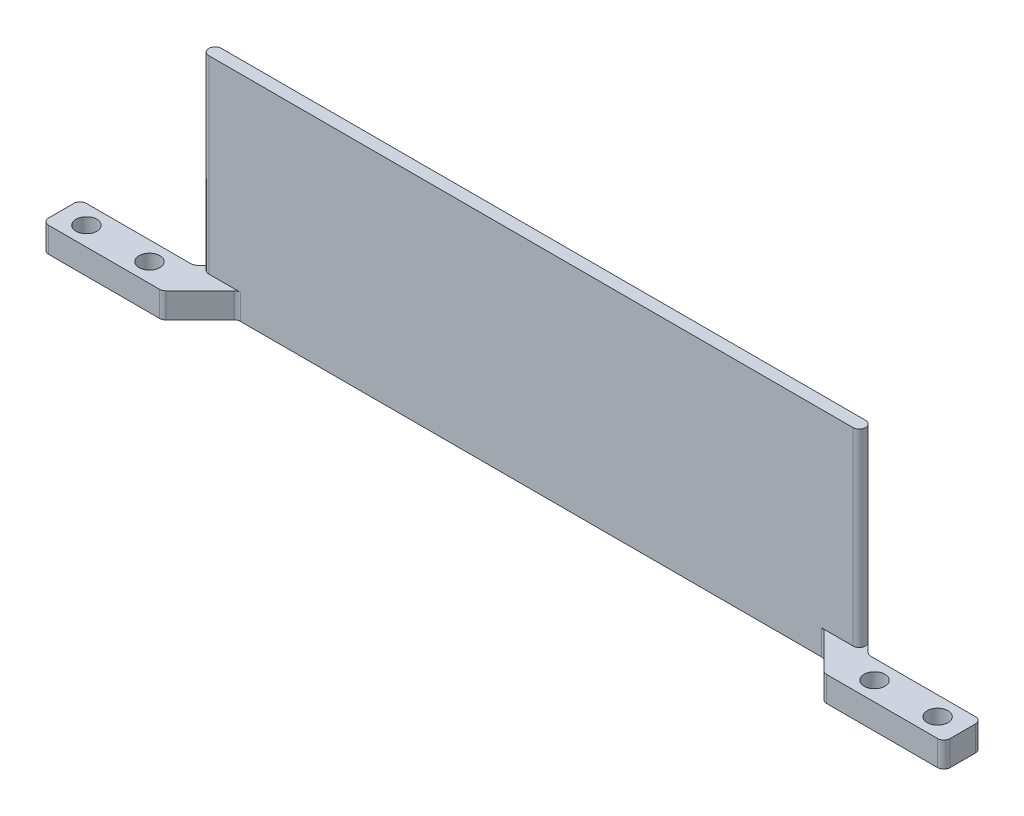
ISO-10303-21;
HEADER;
FILE_DESCRIPTION(('STEP AP214'),'2;1');
FILE_NAME('part.step','',(''),(''),'','','');
FILE_SCHEMA(('AUTOMOTIVE_DESIGN { 1 0 10303 214 1 1 1 1 }'));
ENDSEC;
DATA;
#1=APPLICATION_CONTEXT('core data for automotive mechanical design processes');
#2=APPLICATION_PROTOCOL_DEFINITION('international standard','automotive_design',2000,#1);
#3=PRODUCT_CONTEXT('',#1,'mechanical');
#4=PRODUCT('Part','Part','',(#3));
#5=PRODUCT_RELATED_PRODUCT_CATEGORY('part','',(#4));
#6=PRODUCT_DEFINITION_FORMATION('','',#4);
#7=PRODUCT_DEFINITION_CONTEXT('part definition',#1,'design');
#8=PRODUCT_DEFINITION('design','',#6,#7);
#9=PRODUCT_DEFINITION_SHAPE('','',#8);
#10=(LENGTH_UNIT() NAMED_UNIT(*) SI_UNIT(.MILLI.,.METRE.));
#11=(NAMED_UNIT(*) PLANE_ANGLE_UNIT() SI_UNIT($,.RADIAN.));
#12=(NAMED_UNIT(*) SI_UNIT($,.STERADIAN.) SOLID_ANGLE_UNIT());
#13=UNCERTAINTY_MEASURE_WITH_UNIT(LENGTH_MEASURE(1.E-05),#10,'distance_accuracy_value','');
#14=(GEOMETRIC_REPRESENTATION_CONTEXT(3) GLOBAL_UNCERTAINTY_ASSIGNED_CONTEXT((#13)) GLOBAL_UNIT_ASSIGNED_CONTEXT((#10,
#11,#12)) REPRESENTATION_CONTEXT('',''));
#15=CARTESIAN_POINT('',(0.,0.,0.));
#16=DIRECTION('',(0.,0.,1.));
#17=DIRECTION('',(1.,0.,0.));
#18=AXIS2_PLACEMENT_3D('',#15,#16,#17);
#19=CARTESIAN_POINT('',(0.,4.,0.));
#20=DIRECTION('',(0.,1.,0.));
#21=DIRECTION('',(0.,0.,1.));
#22=AXIS2_PLACEMENT_3D('',#19,#20,#21);
#23=PLANE('',#22);
#24=DIRECTION('',(0.707106781186548,0.,-0.707106781186547));
#25=VECTOR('',#24,1.);
#26=CARTESIAN_POINT('',(-28.25,4.,-28.25));
#27=LINE('',#26,#25);
#28=CARTESIAN_POINT('',(-53.2071067811866,4.,-3.29289321881346));
#29=VERTEX_POINT('',#28);
#30=CARTESIAN_POINT('',(-51.7928932188135,4.,-4.70710678118655));
#31=VERTEX_POINT('',#30);
#32=EDGE_CURVE('E280',#29,#31,#27,.T.);
#33=ORIENTED_EDGE('',*,*,#32,.F.);
#34=CARTESIAN_POINT('',(-53.9142135623731,4.,-4.));
#35=DIRECTION('',(0.,1.,0.));
#36=DIRECTION('',(0.,0.,1.));
#37=AXIS2_PLACEMENT_3D('',#34,#35,#36);
#38=CIRCLE('',#37,1.);
#39=CARTESIAN_POINT('',(-53.9142135623731,4.,-3.));
#40=VERTEX_POINT('',#39);
#41=EDGE_CURVE('E11',#29,#40,#38,.F.);
#42=ORIENTED_EDGE('',*,*,#41,.T.);
#43=DIRECTION('',(-1.,0.,0.));
#44=VECTOR('',#43,1.);
#45=CARTESIAN_POINT('',(-71.5,4.,-3.));
#46=LINE('',#45,#44);
#47=CARTESIAN_POINT('',(-70.5,4.,-3.));
#48=VERTEX_POINT('',#47);
#49=EDGE_CURVE('E271',#40,#48,#46,.T.);
#50=ORIENTED_EDGE('',*,*,#49,.T.);
#51=CARTESIAN_POINT('',(-70.5,4.,-2.));
#52=DIRECTION('',(0.,1.,0.));
#53=DIRECTION('',(0.,0.,1.));
#54=AXIS2_PLACEMENT_3D('',#51,#52,#53);
#55=CIRCLE('',#54,1.);
#56=CARTESIAN_POINT('',(-71.5,4.,-2.));
#57=VERTEX_POINT('',#56);
#58=EDGE_CURVE('E330',#48,#57,#55,.T.);
#59=ORIENTED_EDGE('',*,*,#58,.T.);
#60=DIRECTION('',(0.,0.,1.));
#61=VECTOR('',#60,1.);
#62=CARTESIAN_POINT('',(-71.5,4.,-3.));
#63=LINE('',#62,#61);
#64=CARTESIAN_POINT('',(-71.5,4.,2.));
#65=VERTEX_POINT('',#64);
#66=EDGE_CURVE('E504',#57,#65,#63,.T.);
#67=ORIENTED_EDGE('',*,*,#66,.T.);
#68=CARTESIAN_POINT('',(-70.5,4.,2.));
#69=DIRECTION('',(0.,1.,0.));
#70=DIRECTION('',(0.,0.,1.));
#71=AXIS2_PLACEMENT_3D('',#68,#69,#70);
#72=CIRCLE('',#71,1.);
#73=CARTESIAN_POINT('',(-70.5,4.,3.));
#74=VERTEX_POINT('',#73);
#75=EDGE_CURVE('E328',#65,#74,#72,.T.);
#76=ORIENTED_EDGE('',*,*,#75,.T.);
#77=DIRECTION('',(1.,0.,0.));
#78=VECTOR('',#77,1.);
#79=CARTESIAN_POINT('',(-71.5,4.,3.));
#80=LINE('',#79,#78);
#81=CARTESIAN_POINT('',(-52.9142135623731,4.,3.));
#82=VERTEX_POINT('',#81);
#83=EDGE_CURVE('E499',#74,#82,#80,.T.);
#84=ORIENTED_EDGE('',*,*,#83,.T.);
#85=CARTESIAN_POINT('',(-52.9142135623731,4.,2.));
#86=DIRECTION('',(0.,1.,0.));
#87=DIRECTION('',(0.,0.,1.));
#88=AXIS2_PLACEMENT_3D('',#85,#86,#87);
#89=CIRCLE('',#88,1.);
#90=CARTESIAN_POINT('',(-52.2071067811865,4.,2.70710678118654));
#91=VERTEX_POINT('',#90);
#92=EDGE_CURVE('E326',#82,#91,#89,.T.);
#93=ORIENTED_EDGE('',*,*,#92,.T.);
#94=DIRECTION('',(0.707106781186546,0.,-0.707106781186549));
#95=VECTOR('',#94,1.);
#96=CARTESIAN_POINT('',(-52.5,4.,3.));
#97=LINE('',#96,#95);
#98=CARTESIAN_POINT('',(-46.7928932188135,4.,-2.70710678118654));
#99=VERTEX_POINT('',#98);
#100=EDGE_CURVE('E498',#91,#99,#97,.T.);
#101=ORIENTED_EDGE('',*,*,#100,.T.);
#102=CARTESIAN_POINT('',(-46.0857864376269,4.,-2.));
#103=DIRECTION('',(0.,1.,0.));
#104=DIRECTION('',(0.,0.,1.));
#105=AXIS2_PLACEMENT_3D('',#102,#103,#104);
#106=CIRCLE('',#105,1.);
#107=CARTESIAN_POINT('',(-46.0857864376269,4.,-3.));
#108=VERTEX_POINT('',#107);
#109=EDGE_CURVE('E231',#99,#108,#106,.F.);
#110=ORIENTED_EDGE('',*,*,#109,.T.);
#111=DIRECTION('',(1.,0.,0.));
#112=VECTOR('',#111,1.);
#113=CARTESIAN_POINT('',(-53.5,4.,-3.));
#114=LINE('',#113,#112);
#115=CARTESIAN_POINT('',(-51.0857864376269,4.,-3.));
#116=VERTEX_POINT('',#115);
#117=EDGE_CURVE('E243',#116,#108,#114,.T.);
#118=ORIENTED_EDGE('',*,*,#117,.F.);
#119=CARTESIAN_POINT('',(-51.0857864376269,4.,-4.));
#120=DIRECTION('',(0.,1.,0.));
#121=DIRECTION('',(0.,0.,1.));
#122=AXIS2_PLACEMENT_3D('',#119,#120,#121);
#123=CIRCLE('',#122,1.);
#124=EDGE_CURVE('E365',#116,#31,#123,.F.);
#125=ORIENTED_EDGE('',*,*,#124,.T.);
#126=EDGE_LOOP('',(#33,#42,#50,#59,#67,#76,#84,#93,#101,#110,#118,#125));
#127=FACE_BOUND('',#126,.T.);
#128=CARTESIAN_POINT('',(-67.5,4.,0.));
#129=DIRECTION('',(0.,1.,0.));
#130=DIRECTION('',(0.,0.,1.));
#131=AXIS2_PLACEMENT_3D('',#128,#129,#130);
#132=CIRCLE('',#131,1.65);
#133=CARTESIAN_POINT('',(-67.5,4.,1.65));
#134=VERTEX_POINT('',#133);
#135=EDGE_CURVE('E515',#134,#134,#132,.T.);
#136=ORIENTED_EDGE('',*,*,#135,.F.);
#137=EDGE_LOOP('',(#136));
#138=FACE_BOUND('',#137,.T.);
#139=CARTESIAN_POINT('',(-57.5,4.,0.));
#140=DIRECTION('',(0.,1.,0.));
#141=DIRECTION('',(0.,0.,1.));
#142=AXIS2_PLACEMENT_3D('',#139,#140,#141);
#143=CIRCLE('',#142,1.65);
#144=CARTESIAN_POINT('',(-57.5,4.,1.65));
#145=VERTEX_POINT('',#144);
#146=EDGE_CURVE('E475',#145,#145,#143,.T.);
#147=ORIENTED_EDGE('',*,*,#146,.F.);
#148=EDGE_LOOP('',(#147));
#149=FACE_BOUND('',#148,.T.);
#150=ADVANCED_FACE('F44',(#127,#138,#149),#23,.T.);
#151=DIRECTION('',(0.707106781186546,0.,0.707106781186549));
#152=VECTOR('',#151,1.);
#153=CARTESIAN_POINT('',(52.5,4.,3.));
#154=LINE('',#153,#152);
#155=CARTESIAN_POINT('',(46.7928932188135,4.,-2.70710678118655));
#156=VERTEX_POINT('',#155);
#157=CARTESIAN_POINT('',(52.2071067811866,4.,2.70710678118655));
#158=VERTEX_POINT('',#157);
#159=EDGE_CURVE('E443',#156,#158,#154,.T.);
#160=ORIENTED_EDGE('',*,*,#159,.T.);
#161=CARTESIAN_POINT('',(52.9142135623731,4.,2.));
#162=DIRECTION('',(0.,1.,0.));
#163=DIRECTION('',(0.,0.,1.));
#164=AXIS2_PLACEMENT_3D('',#161,#162,#163);
#165=CIRCLE('',#164,1.);
#166=CARTESIAN_POINT('',(52.9142135623731,4.,3.));
#167=VERTEX_POINT('',#166);
#168=EDGE_CURVE('E355',#158,#167,#165,.T.);
#169=ORIENTED_EDGE('',*,*,#168,.T.);
#170=DIRECTION('',(1.,0.,0.));
#171=VECTOR('',#170,1.);
#172=CARTESIAN_POINT('',(71.5,4.,3.));
#173=LINE('',#172,#171);
#174=CARTESIAN_POINT('',(70.5,4.,3.));
#175=VERTEX_POINT('',#174);
#176=EDGE_CURVE('E434',#167,#175,#173,.T.);
#177=ORIENTED_EDGE('',*,*,#176,.T.);
#178=CARTESIAN_POINT('',(70.5,4.,2.));
#179=DIRECTION('',(0.,1.,0.));
#180=DIRECTION('',(0.,0.,1.));
#181=AXIS2_PLACEMENT_3D('',#178,#179,#180);
#182=CIRCLE('',#181,1.);
#183=CARTESIAN_POINT('',(71.5,4.,2.));
#184=VERTEX_POINT('',#183);
#185=EDGE_CURVE('E353',#175,#184,#182,.T.);
#186=ORIENTED_EDGE('',*,*,#185,.T.);
#187=DIRECTION('',(0.,0.,-1.));
#188=VECTOR('',#187,1.);
#189=CARTESIAN_POINT('',(71.5,4.,-3.));
#190=LINE('',#189,#188);
#191=CARTESIAN_POINT('',(71.5,4.,-2.));
#192=VERTEX_POINT('',#191);
#193=EDGE_CURVE('E423',#184,#192,#190,.T.);
#194=ORIENTED_EDGE('',*,*,#193,.T.);
#195=CARTESIAN_POINT('',(70.5,4.,-2.));
#196=DIRECTION('',(0.,1.,0.));
#197=DIRECTION('',(0.,0.,1.));
#198=AXIS2_PLACEMENT_3D('',#195,#196,#197);
#199=CIRCLE('',#198,1.);
#200=CARTESIAN_POINT('',(70.5,4.,-3.));
#201=VERTEX_POINT('',#200);
#202=EDGE_CURVE('E351',#192,#201,#199,.T.);
#203=ORIENTED_EDGE('',*,*,#202,.T.);
#204=DIRECTION('',(-1.,0.,0.));
#205=VECTOR('',#204,1.);
#206=CARTESIAN_POINT('',(71.5,4.,-3.));
#207=LINE('',#206,#205);
#208=CARTESIAN_POINT('',(53.9142135623731,4.,-3.));
#209=VERTEX_POINT('',#208);
#210=EDGE_CURVE('E398',#201,#209,#207,.T.);
#211=ORIENTED_EDGE('',*,*,#210,.T.);
#212=CARTESIAN_POINT('',(53.9142135623731,4.,-4.));
#213=DIRECTION('',(0.,1.,0.));
#214=DIRECTION('',(0.,0.,1.));
#215=AXIS2_PLACEMENT_3D('',#212,#213,#214);
#216=CIRCLE('',#215,1.);
#217=CARTESIAN_POINT('',(53.2071067811866,4.,-3.29289321881346));
#218=VERTEX_POINT('',#217);
#219=EDGE_CURVE('E390',#209,#218,#216,.F.);
#220=ORIENTED_EDGE('',*,*,#219,.T.);
#221=DIRECTION('',(0.707106781186548,0.,0.707106781186547));
#222=VECTOR('',#221,1.);
#223=CARTESIAN_POINT('',(28.25,4.,-28.25));
#224=LINE('',#223,#222);
#225=CARTESIAN_POINT('',(51.7928932188135,4.,-4.70710678118655));
#226=VERTEX_POINT('',#225);
#227=EDGE_CURVE('E293',#226,#218,#224,.T.);
#228=ORIENTED_EDGE('',*,*,#227,.F.);
#229=CARTESIAN_POINT('',(51.0857864376269,4.,-4.));
#230=DIRECTION('',(0.,1.,0.));
#231=DIRECTION('',(0.,0.,1.));
#232=AXIS2_PLACEMENT_3D('',#229,#230,#231);
#233=CIRCLE('',#232,1.);
#234=CARTESIAN_POINT('',(51.0857864376269,4.,-3.));
#235=VERTEX_POINT('',#234);
#236=EDGE_CURVE('E232',#226,#235,#233,.F.);
#237=ORIENTED_EDGE('',*,*,#236,.T.);
#238=CARTESIAN_POINT('',(46.0857864376269,4.,-3.));
#239=VERTEX_POINT('',#238);
#240=EDGE_CURVE('E272',#239,#235,#114,.T.);
#241=ORIENTED_EDGE('',*,*,#240,.F.);
#242=CARTESIAN_POINT('',(46.0857864376269,4.,-2.));
#243=DIRECTION('',(0.,1.,0.));
#244=DIRECTION('',(0.,0.,1.));
#245=AXIS2_PLACEMENT_3D('',#242,#243,#244);
#246=CIRCLE('',#245,1.);
#247=EDGE_CURVE('E371',#239,#156,#246,.F.);
#248=ORIENTED_EDGE('',*,*,#247,.T.);
#249=EDGE_LOOP('',(#160,#169,#177,#186,#194,#203,#211,#220,#228,#237,#241,#248));
#250=FACE_BOUND('',#249,.T.);
#251=CARTESIAN_POINT('',(67.5,4.,0.));
#252=DIRECTION('',(0.,1.,0.));
#253=DIRECTION('',(0.,0.,-1.));
#254=AXIS2_PLACEMENT_3D('',#251,#252,#253);
#255=CIRCLE('',#254,1.65);
#256=CARTESIAN_POINT('',(67.5,4.,-1.65));
#257=VERTEX_POINT('',#256);
#258=EDGE_CURVE('E521',#257,#257,#255,.T.);
#259=ORIENTED_EDGE('',*,*,#258,.F.);
#260=EDGE_LOOP('',(#259));
#261=FACE_BOUND('',#260,.T.);
#262=CARTESIAN_POINT('',(57.5,4.,0.));
#263=DIRECTION('',(0.,1.,0.));
#264=DIRECTION('',(0.,0.,-1.));
#265=AXIS2_PLACEMENT_3D('',#262,#263,#264);
#266=CIRCLE('',#265,1.65);
#267=CARTESIAN_POINT('',(57.5,4.,-1.65));
#268=VERTEX_POINT('',#267);
#269=EDGE_CURVE('E527',#268,#268,#266,.T.);
#270=ORIENTED_EDGE('',*,*,#269,.F.);
#271=EDGE_LOOP('',(#270));
#272=FACE_BOUND('',#271,.T.);
#273=ADVANCED_FACE('F395',(#250,#261,#272),#23,.T.);
#274=CARTESIAN_POINT('',(0.,0.,0.));
#275=DIRECTION('',(0.,1.,0.));
#276=DIRECTION('',(0.,0.,1.));
#277=AXIS2_PLACEMENT_3D('',#274,#275,#276);
#278=PLANE('',#277);
#279=DIRECTION('',(-1.,0.,0.));
#280=VECTOR('',#279,1.);
#281=CARTESIAN_POINT('',(-51.5,0.,-5.));
#282=LINE('',#281,#280);
#283=CARTESIAN_POINT('',(51.0857864376269,0.,-5.));
#284=VERTEX_POINT('',#283);
#285=CARTESIAN_POINT('',(-51.0857864376269,0.,-5.));
#286=VERTEX_POINT('',#285);
#287=EDGE_CURVE('E467',#284,#286,#282,.T.);
#288=ORIENTED_EDGE('',*,*,#287,.F.);
#289=CARTESIAN_POINT('',(51.0857864376269,0.,-4.));
#290=DIRECTION('',(0.,1.,0.));
#291=DIRECTION('',(0.,0.,1.));
#292=AXIS2_PLACEMENT_3D('',#289,#290,#291);
#293=CIRCLE('',#292,1.);
#294=CARTESIAN_POINT('',(51.7928932188135,0.,-4.70710678118655));
#295=VERTEX_POINT('',#294);
#296=EDGE_CURVE('E315',#284,#295,#293,.F.);
#297=ORIENTED_EDGE('',*,*,#296,.T.);
#298=DIRECTION('',(-0.707106781186548,0.,-0.707106781186547));
#299=VECTOR('',#298,1.);
#300=CARTESIAN_POINT('',(51.5,0.,-5.));
#301=LINE('',#300,#299);
#302=CARTESIAN_POINT('',(53.2071067811866,0.,-3.29289321881346));
#303=VERTEX_POINT('',#302);
#304=EDGE_CURVE('E409',#303,#295,#301,.T.);
#305=ORIENTED_EDGE('',*,*,#304,.F.);
#306=CARTESIAN_POINT('',(53.9142135623731,0.,-4.));
#307=DIRECTION('',(0.,1.,0.));
#308=DIRECTION('',(0.,0.,1.));
#309=AXIS2_PLACEMENT_3D('',#306,#307,#308);
#310=CIRCLE('',#309,1.);
#311=CARTESIAN_POINT('',(53.9142135623731,0.,-3.));
#312=VERTEX_POINT('',#311);
#313=EDGE_CURVE('E388',#303,#312,#310,.T.);
#314=ORIENTED_EDGE('',*,*,#313,.T.);
#315=DIRECTION('',(-1.,0.,0.));
#316=VECTOR('',#315,1.);
#317=CARTESIAN_POINT('',(71.5,0.,-3.));
#318=LINE('',#317,#316);
#319=CARTESIAN_POINT('',(70.5,0.,-3.));
#320=VERTEX_POINT('',#319);
#321=EDGE_CURVE('E268',#320,#312,#318,.T.);
#322=ORIENTED_EDGE('',*,*,#321,.F.);
#323=CARTESIAN_POINT('',(70.5,0.,-2.));
#324=DIRECTION('',(0.,1.,0.));
#325=DIRECTION('',(0.,0.,1.));
#326=AXIS2_PLACEMENT_3D('',#323,#324,#325);
#327=CIRCLE('',#326,1.);
#328=CARTESIAN_POINT('',(71.5,0.,-2.));
#329=VERTEX_POINT('',#328);
#330=EDGE_CURVE('E302',#320,#329,#327,.F.);
#331=ORIENTED_EDGE('',*,*,#330,.T.);
#332=DIRECTION('',(0.,0.,-1.));
#333=VECTOR('',#332,1.);
#334=CARTESIAN_POINT('',(71.5,0.,-3.));
#335=LINE('',#334,#333);
#336=CARTESIAN_POINT('',(71.5,0.,2.));
#337=VERTEX_POINT('',#336);
#338=EDGE_CURVE('E265',#337,#329,#335,.T.);
#339=ORIENTED_EDGE('',*,*,#338,.F.);
#340=CARTESIAN_POINT('',(70.5,0.,2.));
#341=DIRECTION('',(0.,1.,0.));
#342=DIRECTION('',(0.,0.,1.));
#343=AXIS2_PLACEMENT_3D('',#340,#341,#342);
#344=CIRCLE('',#343,1.);
#345=CARTESIAN_POINT('',(70.5,0.,3.));
#346=VERTEX_POINT('',#345);
#347=EDGE_CURVE('E304',#337,#346,#344,.F.);
#348=ORIENTED_EDGE('',*,*,#347,.T.);
#349=DIRECTION('',(1.,0.,0.));
#350=VECTOR('',#349,1.);
#351=CARTESIAN_POINT('',(71.5,0.,3.));
#352=LINE('',#351,#350);
#353=CARTESIAN_POINT('',(52.9142135623731,0.,3.));
#354=VERTEX_POINT('',#353);
#355=EDGE_CURVE('E257',#354,#346,#352,.T.);
#356=ORIENTED_EDGE('',*,*,#355,.F.);
#357=CARTESIAN_POINT('',(52.9142135623731,0.,2.));
#358=DIRECTION('',(0.,1.,0.));
#359=DIRECTION('',(0.,0.,1.));
#360=AXIS2_PLACEMENT_3D('',#357,#358,#359);
#361=CIRCLE('',#360,1.);
#362=CARTESIAN_POINT('',(52.2071067811866,0.,2.70710678118655));
#363=VERTEX_POINT('',#362);
#364=EDGE_CURVE('E306',#354,#363,#361,.F.);
#365=ORIENTED_EDGE('',*,*,#364,.T.);
#366=DIRECTION('',(0.707106781186546,0.,0.707106781186549));
#367=VECTOR('',#366,1.);
#368=CARTESIAN_POINT('',(52.5,0.,3.));
#369=LINE('',#368,#367);
#370=CARTESIAN_POINT('',(46.7928932188135,0.,-2.70710678118655));
#371=VERTEX_POINT('',#370);
#372=EDGE_CURVE('E253',#371,#363,#369,.T.);
#373=ORIENTED_EDGE('',*,*,#372,.F.);
#374=CARTESIAN_POINT('',(46.0857864376269,0.,-2.));
#375=DIRECTION('',(0.,1.,0.));
#376=DIRECTION('',(0.,0.,1.));
#377=AXIS2_PLACEMENT_3D('',#374,#375,#376);
#378=CIRCLE('',#377,1.);
#379=CARTESIAN_POINT('',(46.0857864376269,0.,-3.));
#380=VERTEX_POINT('',#379);
#381=EDGE_CURVE('E252',#371,#380,#378,.T.);
#382=ORIENTED_EDGE('',*,*,#381,.T.);
#383=DIRECTION('',(1.,0.,0.));
#384=VECTOR('',#383,1.);
#385=CARTESIAN_POINT('',(-46.5,0.,-3.));
#386=LINE('',#385,#384);
#387=CARTESIAN_POINT('',(-46.0857864376269,0.,-3.));
#388=VERTEX_POINT('',#387);
#389=EDGE_CURVE('E239',#388,#380,#386,.T.);
#390=ORIENTED_EDGE('',*,*,#389,.F.);
#391=CARTESIAN_POINT('',(-46.0857864376269,0.,-2.));
#392=DIRECTION('',(0.,1.,0.));
#393=DIRECTION('',(0.,0.,1.));
#394=AXIS2_PLACEMENT_3D('',#391,#392,#393);
#395=CIRCLE('',#394,1.);
#396=CARTESIAN_POINT('',(-46.7928932188135,0.,-2.70710678118654));
#397=VERTEX_POINT('',#396);
#398=EDGE_CURVE('E222',#388,#397,#395,.T.);
#399=ORIENTED_EDGE('',*,*,#398,.T.);
#400=DIRECTION('',(0.707106781186546,0.,-0.707106781186549));
#401=VECTOR('',#400,1.);
#402=CARTESIAN_POINT('',(-52.5,0.,3.));
#403=LINE('',#402,#401);
#404=CARTESIAN_POINT('',(-52.2071067811865,0.,2.70710678118654));
#405=VERTEX_POINT('',#404);
#406=EDGE_CURVE('E254',#405,#397,#403,.T.);
#407=ORIENTED_EDGE('',*,*,#406,.F.);
#408=CARTESIAN_POINT('',(-52.9142135623731,0.,2.));
#409=DIRECTION('',(0.,1.,0.));
#410=DIRECTION('',(0.,0.,1.));
#411=AXIS2_PLACEMENT_3D('',#408,#409,#410);
#412=CIRCLE('',#411,1.);
#413=CARTESIAN_POINT('',(-52.9142135623731,0.,3.));
#414=VERTEX_POINT('',#413);
#415=EDGE_CURVE('E300',#405,#414,#412,.F.);
#416=ORIENTED_EDGE('',*,*,#415,.T.);
#417=DIRECTION('',(1.,0.,0.));
#418=VECTOR('',#417,1.);
#419=CARTESIAN_POINT('',(-71.5,0.,3.));
#420=LINE('',#419,#418);
#421=CARTESIAN_POINT('',(-70.5,0.,3.));
#422=VERTEX_POINT('',#421);
#423=EDGE_CURVE('E259',#422,#414,#420,.T.);
#424=ORIENTED_EDGE('',*,*,#423,.F.);
#425=CARTESIAN_POINT('',(-70.5,0.,2.));
#426=DIRECTION('',(0.,1.,0.));
#427=DIRECTION('',(0.,0.,1.));
#428=AXIS2_PLACEMENT_3D('',#425,#426,#427);
#429=CIRCLE('',#428,1.);
#430=CARTESIAN_POINT('',(-71.5,0.,2.));
#431=VERTEX_POINT('',#430);
#432=EDGE_CURVE('E308',#422,#431,#429,.F.);
#433=ORIENTED_EDGE('',*,*,#432,.T.);
#434=DIRECTION('',(0.,0.,1.));
#435=VECTOR('',#434,1.);
#436=CARTESIAN_POINT('',(-71.5,0.,-3.));
#437=LINE('',#436,#435);
#438=CARTESIAN_POINT('',(-71.5,0.,-2.));
#439=VERTEX_POINT('',#438);
#440=EDGE_CURVE('E480',#439,#431,#437,.T.);
#441=ORIENTED_EDGE('',*,*,#440,.F.);
#442=CARTESIAN_POINT('',(-70.5,0.,-2.));
#443=DIRECTION('',(0.,1.,0.));
#444=DIRECTION('',(0.,0.,1.));
#445=AXIS2_PLACEMENT_3D('',#442,#443,#444);
#446=CIRCLE('',#445,1.);
#447=CARTESIAN_POINT('',(-70.5,0.,-3.));
#448=VERTEX_POINT('',#447);
#449=EDGE_CURVE('E310',#439,#448,#446,.F.);
#450=ORIENTED_EDGE('',*,*,#449,.T.);
#451=DIRECTION('',(-1.,0.,0.));
#452=VECTOR('',#451,1.);
#453=CARTESIAN_POINT('',(-71.5,0.,-3.));
#454=LINE('',#453,#452);
#455=CARTESIAN_POINT('',(-53.9142135623731,0.,-3.));
#456=VERTEX_POINT('',#455);
#457=EDGE_CURVE('E473',#456,#448,#454,.T.);
#458=ORIENTED_EDGE('',*,*,#457,.F.);
#459=CARTESIAN_POINT('',(-53.9142135623731,0.,-4.));
#460=DIRECTION('',(0.,1.,0.));
#461=DIRECTION('',(0.,0.,1.));
#462=AXIS2_PLACEMENT_3D('',#459,#460,#461);
#463=CIRCLE('',#462,1.);
#464=CARTESIAN_POINT('',(-53.2071067811866,0.,-3.29289321881346));
#465=VERTEX_POINT('',#464);
#466=EDGE_CURVE('E52',#456,#465,#463,.T.);
#467=ORIENTED_EDGE('',*,*,#466,.T.);
#468=DIRECTION('',(-0.707106781186548,0.,0.707106781186547));
#469=VECTOR('',#468,1.);
#470=CARTESIAN_POINT('',(-51.5,0.,-5.));
#471=LINE('',#470,#469);
#472=CARTESIAN_POINT('',(-51.7928932188135,0.,-4.70710678118655));
#473=VERTEX_POINT('',#472);
#474=EDGE_CURVE('E471',#473,#465,#471,.T.);
#475=ORIENTED_EDGE('',*,*,#474,.F.);
#476=CARTESIAN_POINT('',(-51.0857864376269,0.,-4.));
#477=DIRECTION('',(0.,1.,0.));
#478=DIRECTION('',(0.,0.,1.));
#479=AXIS2_PLACEMENT_3D('',#476,#477,#478);
#480=CIRCLE('',#479,1.);
#481=EDGE_CURVE('E313',#473,#286,#480,.F.);
#482=ORIENTED_EDGE('',*,*,#481,.T.);
#483=EDGE_LOOP('',(#288,#297,#305,#314,#322,#331,#339,#348,#356,#365,#373,#382,#390,#399,#407,
#416,#424,#433,#441,#450,#458,#467,#475,#482));
#484=FACE_BOUND('',#483,.T.);
#485=CARTESIAN_POINT('',(-57.5,0.,0.));
#486=DIRECTION('',(0.,1.,0.));
#487=DIRECTION('',(0.,0.,1.));
#488=AXIS2_PLACEMENT_3D('',#485,#486,#487);
#489=CIRCLE('',#488,1.65);
#490=CARTESIAN_POINT('',(-57.5,0.,1.65));
#491=VERTEX_POINT('',#490);
#492=EDGE_CURVE('E512',#491,#491,#489,.T.);
#493=ORIENTED_EDGE('',*,*,#492,.T.);
#494=EDGE_LOOP('',(#493));
#495=FACE_BOUND('',#494,.T.);
#496=CARTESIAN_POINT('',(-67.5,0.,0.));
#497=DIRECTION('',(0.,1.,0.));
#498=DIRECTION('',(0.,0.,1.));
#499=AXIS2_PLACEMENT_3D('',#496,#497,#498);
#500=CIRCLE('',#499,1.65);
#501=CARTESIAN_POINT('',(-67.5,0.,1.65));
#502=VERTEX_POINT('',#501);
#503=EDGE_CURVE('E518',#502,#502,#500,.T.);
#504=ORIENTED_EDGE('',*,*,#503,.T.);
#505=EDGE_LOOP('',(#504));
#506=FACE_BOUND('',#505,.T.);
#507=CARTESIAN_POINT('',(67.5,0.,0.));
#508=DIRECTION('',(0.,1.,0.));
#509=DIRECTION('',(0.,0.,-1.));
#510=AXIS2_PLACEMENT_3D('',#507,#508,#509);
#511=CIRCLE('',#510,1.65);
#512=CARTESIAN_POINT('',(67.5,0.,-1.65));
#513=VERTEX_POINT('',#512);
#514=EDGE_CURVE('E524',#513,#513,#511,.T.);
#515=ORIENTED_EDGE('',*,*,#514,.T.);
#516=EDGE_LOOP('',(#515));
#517=FACE_BOUND('',#516,.T.);
#518=CARTESIAN_POINT('',(57.5,0.,0.));
#519=DIRECTION('',(0.,1.,0.));
#520=DIRECTION('',(0.,0.,-1.));
#521=AXIS2_PLACEMENT_3D('',#518,#519,#520);
#522=CIRCLE('',#521,1.65);
#523=CARTESIAN_POINT('',(57.5,0.,-1.65));
#524=VERTEX_POINT('',#523);
#525=EDGE_CURVE('E530',#524,#524,#522,.T.);
#526=ORIENTED_EDGE('',*,*,#525,.T.);
#527=EDGE_LOOP('',(#526));
#528=FACE_BOUND('',#527,.T.);
#529=ADVANCED_FACE('F249',(#484,#495,#506,#517,#528),#278,.F.);
#530=CARTESIAN_POINT('',(51.5,4.,-5.));
#531=DIRECTION('',(-0.707106781186547,0.,0.707106781186548));
#532=DIRECTION('',(0.707106781186548,0.,0.707106781186547));
#533=AXIS2_PLACEMENT_3D('',#530,#531,#532);
#534=PLANE('',#533);
#535=ORIENTED_EDGE('',*,*,#227,.T.);
#536=DIRECTION('',(0.,-1.,0.));
#537=VECTOR('',#536,1.);
#538=CARTESIAN_POINT('',(53.2071067811866,0.,-3.29289321881346));
#539=LINE('',#538,#537);
#540=EDGE_CURVE('E373',#218,#303,#539,.T.);
#541=ORIENTED_EDGE('',*,*,#540,.T.);
#542=ORIENTED_EDGE('',*,*,#304,.T.);
#543=DIRECTION('',(0.,-1.,0.));
#544=VECTOR('',#543,1.);
#545=CARTESIAN_POINT('',(51.7928932188135,4.,-4.70710678118655));
#546=LINE('',#545,#544);
#547=EDGE_CURVE('E290',#295,#226,#546,.F.);
#548=ORIENTED_EDGE('',*,*,#547,.T.);
#549=EDGE_LOOP('',(#535,#541,#542,#548));
#550=FACE_BOUND('',#549,.T.);
#551=ADVANCED_FACE('F403',(#550),#534,.F.);
#552=CARTESIAN_POINT('',(-51.5,4.,-5.));
#553=DIRECTION('',(0.,0.,1.));
#554=DIRECTION('',(1.,0.,0.));
#555=AXIS2_PLACEMENT_3D('',#552,#553,#554);
#556=PLANE('',#555);
#557=DIRECTION('',(-1.,0.,0.));
#558=VECTOR('',#557,1.);
#559=CARTESIAN_POINT('',(51.5,34.,-5.));
#560=LINE('',#559,#558);
#561=CARTESIAN_POINT('',(51.0857864376269,34.,-5.));
#562=VERTEX_POINT('',#561);
#563=CARTESIAN_POINT('',(-51.0857864376269,34.,-5.));
#564=VERTEX_POINT('',#563);
#565=EDGE_CURVE('E469',#562,#564,#560,.T.);
#566=ORIENTED_EDGE('',*,*,#565,.F.);
#567=DIRECTION('',(0.,-1.,0.));
#568=VECTOR('',#567,1.);
#569=CARTESIAN_POINT('',(51.0857864376269,4.,-5.));
#570=LINE('',#569,#568);
#571=EDGE_CURVE('E298',#562,#284,#570,.T.);
#572=ORIENTED_EDGE('',*,*,#571,.T.);
#573=ORIENTED_EDGE('',*,*,#287,.T.);
#574=DIRECTION('',(0.,-1.,0.));
#575=VECTOR('',#574,1.);
#576=CARTESIAN_POINT('',(-51.0857864376269,4.,-5.));
#577=LINE('',#576,#575);
#578=EDGE_CURVE('E296',#286,#564,#577,.F.);
#579=ORIENTED_EDGE('',*,*,#578,.T.);
#580=EDGE_LOOP('',(#566,#572,#573,#579));
#581=FACE_BOUND('',#580,.T.);
#582=ADVANCED_FACE('F466',(#581),#556,.F.);
#583=CARTESIAN_POINT('',(-51.5,4.,-5.));
#584=DIRECTION('',(0.707106781186547,0.,0.707106781186548));
#585=DIRECTION('',(0.707106781186548,0.,-0.707106781186547));
#586=AXIS2_PLACEMENT_3D('',#583,#584,#585);
#587=PLANE('',#586);
#588=ORIENTED_EDGE('',*,*,#474,.T.);
#589=DIRECTION('',(0.,-1.,0.));
#590=VECTOR('',#589,1.);
#591=CARTESIAN_POINT('',(-53.2071067811866,4.,-3.29289321881346));
#592=LINE('',#591,#590);
#593=EDGE_CURVE('E65',#465,#29,#592,.F.);
#594=ORIENTED_EDGE('',*,*,#593,.T.);
#595=ORIENTED_EDGE('',*,*,#32,.T.);
#596=DIRECTION('',(0.,-1.,0.));
#597=VECTOR('',#596,1.);
#598=CARTESIAN_POINT('',(-51.7928932188135,4.,-4.70710678118655));
#599=LINE('',#598,#597);
#600=EDGE_CURVE('E278',#31,#473,#599,.T.);
#601=ORIENTED_EDGE('',*,*,#600,.T.);
#602=EDGE_LOOP('',(#588,#594,#595,#601));
#603=FACE_BOUND('',#602,.T.);
#604=ADVANCED_FACE('F601',(#603),#587,.F.);
#605=CARTESIAN_POINT('',(-71.5,4.,-3.));
#606=DIRECTION('',(0.,0.,1.));
#607=DIRECTION('',(1.,0.,0.));
#608=AXIS2_PLACEMENT_3D('',#605,#606,#607);
#609=PLANE('',#608);
#610=ORIENTED_EDGE('',*,*,#49,.F.);
#611=DIRECTION('',(0.,-1.,0.));
#612=VECTOR('',#611,1.);
#613=CARTESIAN_POINT('',(-53.9142135623731,0.,-3.));
#614=LINE('',#613,#612);
#615=EDGE_CURVE('E384',#40,#456,#614,.T.);
#616=ORIENTED_EDGE('',*,*,#615,.T.);
#617=ORIENTED_EDGE('',*,*,#457,.T.);
#618=DIRECTION('',(0.,-1.,0.));
#619=VECTOR('',#618,1.);
#620=CARTESIAN_POINT('',(-70.5,4.,-3.));
#621=LINE('',#620,#619);
#622=EDGE_CURVE('E323',#448,#48,#621,.F.);
#623=ORIENTED_EDGE('',*,*,#622,.T.);
#624=EDGE_LOOP('',(#610,#616,#617,#623));
#625=FACE_BOUND('',#624,.T.);
#626=ADVANCED_FACE('F550',(#625),#609,.F.);
#627=CARTESIAN_POINT('',(-71.5,4.,-3.));
#628=DIRECTION('',(1.,0.,0.));
#629=DIRECTION('',(0.,0.,-1.));
#630=AXIS2_PLACEMENT_3D('',#627,#628,#629);
#631=PLANE('',#630);
#632=ORIENTED_EDGE('',*,*,#66,.F.);
#633=DIRECTION('',(0.,-1.,0.));
#634=VECTOR('',#633,1.);
#635=CARTESIAN_POINT('',(-71.5,4.,-2.));
#636=LINE('',#635,#634);
#637=EDGE_CURVE('E320',#57,#439,#636,.T.);
#638=ORIENTED_EDGE('',*,*,#637,.T.);
#639=ORIENTED_EDGE('',*,*,#440,.T.);
#640=DIRECTION('',(0.,-1.,0.));
#641=VECTOR('',#640,1.);
#642=CARTESIAN_POINT('',(-71.5,4.,2.));
#643=LINE('',#642,#641);
#644=EDGE_CURVE('E318',#431,#65,#643,.F.);
#645=ORIENTED_EDGE('',*,*,#644,.T.);
#646=EDGE_LOOP('',(#632,#638,#639,#645));
#647=FACE_BOUND('',#646,.T.);
#648=ADVANCED_FACE('F560',(#647),#631,.F.);
#649=CARTESIAN_POINT('',(-71.5,4.,3.));
#650=DIRECTION('',(0.,0.,-1.));
#651=DIRECTION('',(-1.,0.,0.));
#652=AXIS2_PLACEMENT_3D('',#649,#650,#651);
#653=PLANE('',#652);
#654=ORIENTED_EDGE('',*,*,#83,.F.);
#655=DIRECTION('',(0.,-1.,0.));
#656=VECTOR('',#655,1.);
#657=CARTESIAN_POINT('',(-70.5,4.,3.));
#658=LINE('',#657,#656);
#659=EDGE_CURVE('E334',#74,#422,#658,.T.);
#660=ORIENTED_EDGE('',*,*,#659,.T.);
#661=ORIENTED_EDGE('',*,*,#423,.T.);
#662=DIRECTION('',(0.,-1.,0.));
#663=VECTOR('',#662,1.);
#664=CARTESIAN_POINT('',(-52.9142135623731,4.,3.));
#665=LINE('',#664,#663);
#666=EDGE_CURVE('E332',#414,#82,#665,.F.);
#667=ORIENTED_EDGE('',*,*,#666,.T.);
#668=EDGE_LOOP('',(#654,#660,#661,#667));
#669=FACE_BOUND('',#668,.T.);
#670=ADVANCED_FACE('F487',(#669),#653,.F.);
#671=CARTESIAN_POINT('',(-52.5,4.,3.));
#672=DIRECTION('',(-0.707106781186549,0.,-0.707106781186546));
#673=DIRECTION('',(-0.707106781186546,0.,0.707106781186549));
#674=AXIS2_PLACEMENT_3D('',#671,#672,#673);
#675=PLANE('',#674);
#676=ORIENTED_EDGE('',*,*,#406,.T.);
#677=DIRECTION('',(0.,-1.,0.));
#678=VECTOR('',#677,1.);
#679=CARTESIAN_POINT('',(-46.7928932188135,4.,-2.70710678118655));
#680=LINE('',#679,#678);
#681=EDGE_CURVE('E227',#397,#99,#680,.F.);
#682=ORIENTED_EDGE('',*,*,#681,.T.);
#683=ORIENTED_EDGE('',*,*,#100,.F.);
#684=DIRECTION('',(0.,-1.,0.));
#685=VECTOR('',#684,1.);
#686=CARTESIAN_POINT('',(-52.2071067811865,4.,2.70710678118654));
#687=LINE('',#686,#685);
#688=EDGE_CURVE('E337',#91,#405,#687,.T.);
#689=ORIENTED_EDGE('',*,*,#688,.T.);
#690=EDGE_LOOP('',(#676,#682,#683,#689));
#691=FACE_BOUND('',#690,.T.);
#692=ADVANCED_FACE('F501',(#691),#675,.F.);
#693=CARTESIAN_POINT('',(-46.5,4.,-3.));
#694=DIRECTION('',(0.,0.,-1.));
#695=DIRECTION('',(-1.,0.,0.));
#696=AXIS2_PLACEMENT_3D('',#693,#694,#695);
#697=PLANE('',#696);
#698=DIRECTION('',(1.,0.,0.));
#699=VECTOR('',#698,1.);
#700=CARTESIAN_POINT('',(-53.5,34.,-3.));
#701=LINE('',#700,#699);
#702=CARTESIAN_POINT('',(-51.0857864376269,34.,-3.));
#703=VERTEX_POINT('',#702);
#704=CARTESIAN_POINT('',(51.0857864376269,34.,-3.));
#705=VERTEX_POINT('',#704);
#706=EDGE_CURVE('E459',#703,#705,#701,.T.);
#707=ORIENTED_EDGE('',*,*,#706,.F.);
#708=DIRECTION('',(0.,-1.,0.));
#709=VECTOR('',#708,1.);
#710=CARTESIAN_POINT('',(-51.0857864376269,4.,-3.));
#711=LINE('',#710,#709);
#712=EDGE_CURVE('E276',#703,#116,#711,.T.);
#713=ORIENTED_EDGE('',*,*,#712,.T.);
#714=ORIENTED_EDGE('',*,*,#117,.T.);
#715=DIRECTION('',(0.,-1.,0.));
#716=VECTOR('',#715,1.);
#717=CARTESIAN_POINT('',(-46.0857864376269,0.,-3.));
#718=LINE('',#717,#716);
#719=EDGE_CURVE('E226',#108,#388,#718,.T.);
#720=ORIENTED_EDGE('',*,*,#719,.T.);
#721=ORIENTED_EDGE('',*,*,#389,.T.);
#722=DIRECTION('',(0.,-1.,0.));
#723=VECTOR('',#722,1.);
#724=CARTESIAN_POINT('',(46.0857864376269,4.,-3.));
#725=LINE('',#724,#723);
#726=EDGE_CURVE('E246',#380,#239,#725,.F.);
#727=ORIENTED_EDGE('',*,*,#726,.T.);
#728=ORIENTED_EDGE('',*,*,#240,.T.);
#729=DIRECTION('',(0.,-1.,0.));
#730=VECTOR('',#729,1.);
#731=CARTESIAN_POINT('',(51.0857864376269,4.,-3.));
#732=LINE('',#731,#730);
#733=EDGE_CURVE('E245',#235,#705,#732,.F.);
#734=ORIENTED_EDGE('',*,*,#733,.T.);
#735=EDGE_LOOP('',(#707,#713,#714,#720,#721,#727,#728,#734));
#736=FACE_BOUND('',#735,.T.);
#737=ADVANCED_FACE('F237',(#736),#697,.F.);
#738=CARTESIAN_POINT('',(52.5,4.,3.));
#739=DIRECTION('',(0.707106781186549,0.,-0.707106781186546));
#740=DIRECTION('',(-0.707106781186546,0.,-0.707106781186549));
#741=AXIS2_PLACEMENT_3D('',#738,#739,#740);
#742=PLANE('',#741);
#743=ORIENTED_EDGE('',*,*,#159,.F.);
#744=DIRECTION('',(0.,-1.,0.));
#745=VECTOR('',#744,1.);
#746=CARTESIAN_POINT('',(46.7928932188135,0.,-2.70710678118655));
#747=LINE('',#746,#745);
#748=EDGE_CURVE('E343',#156,#371,#747,.T.);
#749=ORIENTED_EDGE('',*,*,#748,.T.);
#750=ORIENTED_EDGE('',*,*,#372,.T.);
#751=DIRECTION('',(0.,-1.,0.));
#752=VECTOR('',#751,1.);
#753=CARTESIAN_POINT('',(52.2071067811866,4.,2.70710678118655));
#754=LINE('',#753,#752);
#755=EDGE_CURVE('E341',#363,#158,#754,.F.);
#756=ORIENTED_EDGE('',*,*,#755,.T.);
#757=EDGE_LOOP('',(#743,#749,#750,#756));
#758=FACE_BOUND('',#757,.T.);
#759=ADVANCED_FACE('F441',(#758),#742,.F.);
#760=CARTESIAN_POINT('',(71.5,4.,3.));
#761=DIRECTION('',(0.,0.,-1.));
#762=DIRECTION('',(-1.,0.,0.));
#763=AXIS2_PLACEMENT_3D('',#760,#761,#762);
#764=PLANE('',#763);
#765=ORIENTED_EDGE('',*,*,#176,.F.);
#766=DIRECTION('',(0.,-1.,0.));
#767=VECTOR('',#766,1.);
#768=CARTESIAN_POINT('',(52.9142135623731,4.,3.));
#769=LINE('',#768,#767);
#770=EDGE_CURVE('E348',#167,#354,#769,.T.);
#771=ORIENTED_EDGE('',*,*,#770,.T.);
#772=ORIENTED_EDGE('',*,*,#355,.T.);
#773=DIRECTION('',(0.,-1.,0.));
#774=VECTOR('',#773,1.);
#775=CARTESIAN_POINT('',(70.5,4.,3.));
#776=LINE('',#775,#774);
#777=EDGE_CURVE('E346',#346,#175,#776,.F.);
#778=ORIENTED_EDGE('',*,*,#777,.T.);
#779=EDGE_LOOP('',(#765,#771,#772,#778));
#780=FACE_BOUND('',#779,.T.);
#781=ADVANCED_FACE('F431',(#780),#764,.F.);
#782=CARTESIAN_POINT('',(71.5,4.,-3.));
#783=DIRECTION('',(-1.,0.,0.));
#784=DIRECTION('',(0.,0.,1.));
#785=AXIS2_PLACEMENT_3D('',#782,#783,#784);
#786=PLANE('',#785);
#787=ORIENTED_EDGE('',*,*,#193,.F.);
#788=DIRECTION('',(0.,-1.,0.));
#789=VECTOR('',#788,1.);
#790=CARTESIAN_POINT('',(71.5,4.,2.));
#791=LINE('',#790,#789);
#792=EDGE_CURVE('E359',#184,#337,#791,.T.);
#793=ORIENTED_EDGE('',*,*,#792,.T.);
#794=ORIENTED_EDGE('',*,*,#338,.T.);
#795=DIRECTION('',(0.,-1.,0.));
#796=VECTOR('',#795,1.);
#797=CARTESIAN_POINT('',(71.5,4.,-2.));
#798=LINE('',#797,#796);
#799=EDGE_CURVE('E357',#329,#192,#798,.F.);
#800=ORIENTED_EDGE('',*,*,#799,.T.);
#801=EDGE_LOOP('',(#787,#793,#794,#800));
#802=FACE_BOUND('',#801,.T.);
#803=ADVANCED_FACE('F420',(#802),#786,.F.);
#804=CARTESIAN_POINT('',(71.5,4.,-3.));
#805=DIRECTION('',(0.,0.,1.));
#806=DIRECTION('',(1.,0.,0.));
#807=AXIS2_PLACEMENT_3D('',#804,#805,#806);
#808=PLANE('',#807);
#809=ORIENTED_EDGE('',*,*,#321,.T.);
#810=DIRECTION('',(0.,-1.,0.));
#811=VECTOR('',#810,1.);
#812=CARTESIAN_POINT('',(53.9142135623731,4.,-3.));
#813=LINE('',#812,#811);
#814=EDGE_CURVE('E382',#312,#209,#813,.F.);
#815=ORIENTED_EDGE('',*,*,#814,.T.);
#816=ORIENTED_EDGE('',*,*,#210,.F.);
#817=DIRECTION('',(0.,-1.,0.));
#818=VECTOR('',#817,1.);
#819=CARTESIAN_POINT('',(70.5,4.,-3.));
#820=LINE('',#819,#818);
#821=EDGE_CURVE('E362',#201,#320,#820,.T.);
#822=ORIENTED_EDGE('',*,*,#821,.T.);
#823=EDGE_LOOP('',(#809,#815,#816,#822));
#824=FACE_BOUND('',#823,.T.);
#825=ADVANCED_FACE('F411',(#824),#808,.F.);
#826=CARTESIAN_POINT('',(-57.5,4.,0.));
#827=DIRECTION('',(0.,-1.,0.));
#828=DIRECTION('',(0.,0.,-1.));
#829=AXIS2_PLACEMENT_3D('',#826,#827,#828);
#830=CYLINDRICAL_SURFACE('',#829,1.65);
#831=ORIENTED_EDGE('',*,*,#146,.T.);
#832=EDGE_LOOP('',(#831));
#833=FACE_BOUND('',#832,.T.);
#834=ORIENTED_EDGE('',*,*,#492,.F.);
#835=EDGE_LOOP('',(#834));
#836=FACE_BOUND('',#835,.T.);
#837=ADVANCED_FACE('F579',(#833,#836),#830,.F.);
#838=CARTESIAN_POINT('',(-67.5,4.,0.));
#839=DIRECTION('',(0.,-1.,0.));
#840=DIRECTION('',(0.,0.,-1.));
#841=AXIS2_PLACEMENT_3D('',#838,#839,#840);
#842=CYLINDRICAL_SURFACE('',#841,1.65);
#843=ORIENTED_EDGE('',*,*,#135,.T.);
#844=EDGE_LOOP('',(#843));
#845=FACE_BOUND('',#844,.T.);
#846=ORIENTED_EDGE('',*,*,#503,.F.);
#847=EDGE_LOOP('',(#846));
#848=FACE_BOUND('',#847,.T.);
#849=ADVANCED_FACE('F836',(#845,#848),#842,.F.);
#850=CARTESIAN_POINT('',(67.5,4.,0.));
#851=DIRECTION('',(0.,-1.,0.));
#852=DIRECTION('',(0.,0.,-1.));
#853=AXIS2_PLACEMENT_3D('',#850,#851,#852);
#854=CYLINDRICAL_SURFACE('',#853,1.65);
#855=ORIENTED_EDGE('',*,*,#258,.T.);
#856=EDGE_LOOP('',(#855));
#857=FACE_BOUND('',#856,.T.);
#858=ORIENTED_EDGE('',*,*,#514,.F.);
#859=EDGE_LOOP('',(#858));
#860=FACE_BOUND('',#859,.T.);
#861=ADVANCED_FACE('F845',(#857,#860),#854,.F.);
#862=CARTESIAN_POINT('',(57.5,4.,0.));
#863=DIRECTION('',(0.,-1.,0.));
#864=DIRECTION('',(0.,0.,-1.));
#865=AXIS2_PLACEMENT_3D('',#862,#863,#864);
#866=CYLINDRICAL_SURFACE('',#865,1.65);
#867=ORIENTED_EDGE('',*,*,#269,.T.);
#868=EDGE_LOOP('',(#867));
#869=FACE_BOUND('',#868,.T.);
#870=ORIENTED_EDGE('',*,*,#525,.F.);
#871=EDGE_LOOP('',(#870));
#872=FACE_BOUND('',#871,.T.);
#873=ADVANCED_FACE('F791',(#869,#872),#866,.F.);
#874=CARTESIAN_POINT('',(0.,34.,0.));
#875=DIRECTION('',(0.,1.,0.));
#876=DIRECTION('',(0.,0.,1.));
#877=AXIS2_PLACEMENT_3D('',#874,#875,#876);
#878=PLANE('',#877);
#879=ORIENTED_EDGE('',*,*,#706,.T.);
#880=CARTESIAN_POINT('',(51.0857864376269,34.,-4.));
#881=DIRECTION('',(0.,1.,0.));
#882=DIRECTION('',(0.,0.,1.));
#883=AXIS2_PLACEMENT_3D('',#880,#881,#882);
#884=CIRCLE('',#883,1.);
#885=CARTESIAN_POINT('',(51.7928932188135,34.,-4.70710678118655));
#886=VERTEX_POINT('',#885);
#887=EDGE_CURVE('E288',#705,#886,#884,.T.);
#888=ORIENTED_EDGE('',*,*,#887,.T.);
#889=CARTESIAN_POINT('',(51.0857864376269,34.,-4.));
#890=DIRECTION('',(0.,1.,0.));
#891=DIRECTION('',(0.,0.,1.));
#892=AXIS2_PLACEMENT_3D('',#889,#890,#891);
#893=CIRCLE('',#892,1.);
#894=EDGE_CURVE('E286',#886,#562,#893,.T.);
#895=ORIENTED_EDGE('',*,*,#894,.T.);
#896=ORIENTED_EDGE('',*,*,#565,.T.);
#897=CARTESIAN_POINT('',(-51.0857864376269,34.,-4.));
#898=DIRECTION('',(0.,1.,0.));
#899=DIRECTION('',(0.,0.,1.));
#900=AXIS2_PLACEMENT_3D('',#897,#898,#899);
#901=CIRCLE('',#900,1.);
#902=CARTESIAN_POINT('',(-51.7928932188135,34.,-4.70710678118655));
#903=VERTEX_POINT('',#902);
#904=EDGE_CURVE('E282',#564,#903,#901,.T.);
#905=ORIENTED_EDGE('',*,*,#904,.T.);
#906=CARTESIAN_POINT('',(-51.0857864376269,34.,-4.));
#907=DIRECTION('',(0.,1.,0.));
#908=DIRECTION('',(0.,0.,1.));
#909=AXIS2_PLACEMENT_3D('',#906,#907,#908);
#910=CIRCLE('',#909,1.);
#911=EDGE_CURVE('E284',#903,#703,#910,.T.);
#912=ORIENTED_EDGE('',*,*,#911,.T.);
#913=EDGE_LOOP('',(#879,#888,#895,#896,#905,#912));
#914=FACE_BOUND('',#913,.T.);
#915=ADVANCED_FACE('F456',(#914),#878,.T.);
#916=CARTESIAN_POINT('',(-51.0857864376269,4.,-4.));
#917=DIRECTION('',(0.,-1.,0.));
#918=DIRECTION('',(0.,0.,-1.));
#919=AXIS2_PLACEMENT_3D('',#916,#917,#918);
#920=CYLINDRICAL_SURFACE('',#919,1.);
#921=DIRECTION('',(0.,-1.,0.));
#922=VECTOR('',#921,1.);
#923=CARTESIAN_POINT('',(-51.7928932188135,4.,-4.70710678118655));
#924=LINE('',#923,#922);
#925=EDGE_CURVE('E374',#903,#31,#924,.T.);
#926=ORIENTED_EDGE('',*,*,#925,.F.);
#927=ORIENTED_EDGE('',*,*,#904,.F.);
#928=ORIENTED_EDGE('',*,*,#578,.F.);
#929=ORIENTED_EDGE('',*,*,#481,.F.);
#930=ORIENTED_EDGE('',*,*,#600,.F.);
#931=EDGE_LOOP('',(#926,#927,#928,#929,#930));
#932=FACE_BOUND('',#931,.T.);
#933=ADVANCED_FACE('F539',(#932),#920,.T.);
#934=CARTESIAN_POINT('',(-51.0857864376269,4.,-4.));
#935=DIRECTION('',(0.,-1.,0.));
#936=DIRECTION('',(0.,0.,-1.));
#937=AXIS2_PLACEMENT_3D('',#934,#935,#936);
#938=CYLINDRICAL_SURFACE('',#937,1.);
#939=ORIENTED_EDGE('',*,*,#911,.F.);
#940=ORIENTED_EDGE('',*,*,#925,.T.);
#941=ORIENTED_EDGE('',*,*,#124,.F.);
#942=ORIENTED_EDGE('',*,*,#712,.F.);
#943=EDGE_LOOP('',(#939,#940,#941,#942));
#944=FACE_BOUND('',#943,.T.);
#945=ADVANCED_FACE('F544',(#944),#938,.T.);
#946=CARTESIAN_POINT('',(51.0857864376269,4.,-4.));
#947=DIRECTION('',(0.,-1.,0.));
#948=DIRECTION('',(0.,0.,-1.));
#949=AXIS2_PLACEMENT_3D('',#946,#947,#948);
#950=CYLINDRICAL_SURFACE('',#949,1.);
#951=ORIENTED_EDGE('',*,*,#571,.F.);
#952=ORIENTED_EDGE('',*,*,#894,.F.);
#953=DIRECTION('',(0.,-1.,0.));
#954=VECTOR('',#953,1.);
#955=CARTESIAN_POINT('',(51.7928932188135,4.,-4.70710678118655));
#956=LINE('',#955,#954);
#957=EDGE_CURVE('E377',#226,#886,#956,.F.);
#958=ORIENTED_EDGE('',*,*,#957,.F.);
#959=ORIENTED_EDGE('',*,*,#547,.F.);
#960=ORIENTED_EDGE('',*,*,#296,.F.);
#961=EDGE_LOOP('',(#951,#952,#958,#959,#960));
#962=FACE_BOUND('',#961,.T.);
#963=ADVANCED_FACE('F462',(#962),#950,.T.);
#964=CARTESIAN_POINT('',(51.0857864376269,4.,-4.));
#965=DIRECTION('',(0.,-1.,0.));
#966=DIRECTION('',(0.,0.,-1.));
#967=AXIS2_PLACEMENT_3D('',#964,#965,#966);
#968=CYLINDRICAL_SURFACE('',#967,1.);
#969=ORIENTED_EDGE('',*,*,#887,.F.);
#970=ORIENTED_EDGE('',*,*,#733,.F.);
#971=ORIENTED_EDGE('',*,*,#236,.F.);
#972=ORIENTED_EDGE('',*,*,#957,.T.);
#973=EDGE_LOOP('',(#969,#970,#971,#972));
#974=FACE_BOUND('',#973,.T.);
#975=ADVANCED_FACE('F453',(#974),#968,.T.);
#976=CARTESIAN_POINT('',(-70.5,4.,-2.));
#977=DIRECTION('',(0.,-1.,0.));
#978=DIRECTION('',(0.,0.,-1.));
#979=AXIS2_PLACEMENT_3D('',#976,#977,#978);
#980=CYLINDRICAL_SURFACE('',#979,1.);
#981=ORIENTED_EDGE('',*,*,#58,.F.);
#982=ORIENTED_EDGE('',*,*,#622,.F.);
#983=ORIENTED_EDGE('',*,*,#449,.F.);
#984=ORIENTED_EDGE('',*,*,#637,.F.);
#985=EDGE_LOOP('',(#981,#982,#983,#984));
#986=FACE_BOUND('',#985,.T.);
#987=ADVANCED_FACE('F556',(#986),#980,.T.);
#988=CARTESIAN_POINT('',(-70.5,4.,2.));
#989=DIRECTION('',(0.,-1.,0.));
#990=DIRECTION('',(0.,0.,-1.));
#991=AXIS2_PLACEMENT_3D('',#988,#989,#990);
#992=CYLINDRICAL_SURFACE('',#991,1.);
#993=ORIENTED_EDGE('',*,*,#75,.F.);
#994=ORIENTED_EDGE('',*,*,#644,.F.);
#995=ORIENTED_EDGE('',*,*,#432,.F.);
#996=ORIENTED_EDGE('',*,*,#659,.F.);
#997=EDGE_LOOP('',(#993,#994,#995,#996));
#998=FACE_BOUND('',#997,.T.);
#999=ADVANCED_FACE('F563',(#998),#992,.T.);
#1000=CARTESIAN_POINT('',(-46.0857864376269,4.,-2.));
#1001=DIRECTION('',(0.,1.,0.));
#1002=DIRECTION('',(0.,0.,1.));
#1003=AXIS2_PLACEMENT_3D('',#1000,#1001,#1002);
#1004=CYLINDRICAL_SURFACE('',#1003,1.);
#1005=ORIENTED_EDGE('',*,*,#109,.F.);
#1006=ORIENTED_EDGE('',*,*,#681,.F.);
#1007=ORIENTED_EDGE('',*,*,#398,.F.);
#1008=ORIENTED_EDGE('',*,*,#719,.F.);
#1009=EDGE_LOOP('',(#1005,#1006,#1007,#1008));
#1010=FACE_BOUND('',#1009,.T.);
#1011=ADVANCED_FACE('F225',(#1010),#1004,.F.);
#1012=CARTESIAN_POINT('',(46.0857864376269,4.,-2.));
#1013=DIRECTION('',(0.,1.,0.));
#1014=DIRECTION('',(0.,0.,1.));
#1015=AXIS2_PLACEMENT_3D('',#1012,#1013,#1014);
#1016=CYLINDRICAL_SURFACE('',#1015,1.);
#1017=ORIENTED_EDGE('',*,*,#247,.F.);
#1018=ORIENTED_EDGE('',*,*,#726,.F.);
#1019=ORIENTED_EDGE('',*,*,#381,.F.);
#1020=ORIENTED_EDGE('',*,*,#748,.F.);
#1021=EDGE_LOOP('',(#1017,#1018,#1019,#1020));
#1022=FACE_BOUND('',#1021,.T.);
#1023=ADVANCED_FACE('F446',(#1022),#1016,.F.);
#1024=CARTESIAN_POINT('',(52.9142135623731,4.,2.));
#1025=DIRECTION('',(0.,-1.,0.));
#1026=DIRECTION('',(0.,0.,-1.));
#1027=AXIS2_PLACEMENT_3D('',#1024,#1025,#1026);
#1028=CYLINDRICAL_SURFACE('',#1027,1.);
#1029=ORIENTED_EDGE('',*,*,#168,.F.);
#1030=ORIENTED_EDGE('',*,*,#755,.F.);
#1031=ORIENTED_EDGE('',*,*,#364,.F.);
#1032=ORIENTED_EDGE('',*,*,#770,.F.);
#1033=EDGE_LOOP('',(#1029,#1030,#1031,#1032));
#1034=FACE_BOUND('',#1033,.T.);
#1035=ADVANCED_FACE('F437',(#1034),#1028,.T.);
#1036=CARTESIAN_POINT('',(70.5,4.,2.));
#1037=DIRECTION('',(0.,-1.,0.));
#1038=DIRECTION('',(0.,0.,-1.));
#1039=AXIS2_PLACEMENT_3D('',#1036,#1037,#1038);
#1040=CYLINDRICAL_SURFACE('',#1039,1.);
#1041=ORIENTED_EDGE('',*,*,#185,.F.);
#1042=ORIENTED_EDGE('',*,*,#777,.F.);
#1043=ORIENTED_EDGE('',*,*,#347,.F.);
#1044=ORIENTED_EDGE('',*,*,#792,.F.);
#1045=EDGE_LOOP('',(#1041,#1042,#1043,#1044));
#1046=FACE_BOUND('',#1045,.T.);
#1047=ADVANCED_FACE('F426',(#1046),#1040,.T.);
#1048=CARTESIAN_POINT('',(70.5,4.,-2.));
#1049=DIRECTION('',(0.,-1.,0.));
#1050=DIRECTION('',(0.,0.,-1.));
#1051=AXIS2_PLACEMENT_3D('',#1048,#1049,#1050);
#1052=CYLINDRICAL_SURFACE('',#1051,1.);
#1053=ORIENTED_EDGE('',*,*,#202,.F.);
#1054=ORIENTED_EDGE('',*,*,#799,.F.);
#1055=ORIENTED_EDGE('',*,*,#330,.F.);
#1056=ORIENTED_EDGE('',*,*,#821,.F.);
#1057=EDGE_LOOP('',(#1053,#1054,#1055,#1056));
#1058=FACE_BOUND('',#1057,.T.);
#1059=ADVANCED_FACE('F415',(#1058),#1052,.T.);
#1060=CARTESIAN_POINT('',(-52.9142135623731,4.,2.));
#1061=DIRECTION('',(0.,-1.,0.));
#1062=DIRECTION('',(0.,0.,-1.));
#1063=AXIS2_PLACEMENT_3D('',#1060,#1061,#1062);
#1064=CYLINDRICAL_SURFACE('',#1063,1.);
#1065=ORIENTED_EDGE('',*,*,#92,.F.);
#1066=ORIENTED_EDGE('',*,*,#666,.F.);
#1067=ORIENTED_EDGE('',*,*,#415,.F.);
#1068=ORIENTED_EDGE('',*,*,#688,.F.);
#1069=EDGE_LOOP('',(#1065,#1066,#1067,#1068));
#1070=FACE_BOUND('',#1069,.T.);
#1071=ADVANCED_FACE('F492',(#1070),#1064,.T.);
#1072=CARTESIAN_POINT('',(53.9142135623731,4.,-4.));
#1073=DIRECTION('',(0.,1.,0.));
#1074=DIRECTION('',(0.,0.,1.));
#1075=AXIS2_PLACEMENT_3D('',#1072,#1073,#1074);
#1076=CYLINDRICAL_SURFACE('',#1075,1.);
#1077=ORIENTED_EDGE('',*,*,#219,.F.);
#1078=ORIENTED_EDGE('',*,*,#814,.F.);
#1079=ORIENTED_EDGE('',*,*,#313,.F.);
#1080=ORIENTED_EDGE('',*,*,#540,.F.);
#1081=EDGE_LOOP('',(#1077,#1078,#1079,#1080));
#1082=FACE_BOUND('',#1081,.T.);
#1083=ADVANCED_FACE('F407',(#1082),#1076,.F.);
#1084=CARTESIAN_POINT('',(-53.9142135623731,4.,-4.));
#1085=DIRECTION('',(0.,1.,0.));
#1086=DIRECTION('',(0.,0.,1.));
#1087=AXIS2_PLACEMENT_3D('',#1084,#1085,#1086);
#1088=CYLINDRICAL_SURFACE('',#1087,1.);
#1089=ORIENTED_EDGE('',*,*,#41,.F.);
#1090=ORIENTED_EDGE('',*,*,#593,.F.);
#1091=ORIENTED_EDGE('',*,*,#466,.F.);
#1092=ORIENTED_EDGE('',*,*,#615,.F.);
#1093=EDGE_LOOP('',(#1089,#1090,#1091,#1092));
#1094=FACE_BOUND('',#1093,.T.);
#1095=ADVANCED_FACE('F46',(#1094),#1088,.F.);
#1096=CLOSED_SHELL('',(#150,#273,#529,#551,#582,#604,#626,#648,#670,#692,#737,#759,#781,#803,
#825,#837,#849,#861,#873,#915,#933,#945,#963,#975,#987,#999,#1011,#1023,#1035,#1047,#1059,#1071,
#1083,#1095));
#1097=MANIFOLD_SOLID_BREP('B2',#1096);
#1098=ADVANCED_BREP_SHAPE_REPRESENTATION('',(#18,#1097),#14);
#1099=SHAPE_DEFINITION_REPRESENTATION(#9,#1098);
ENDSEC;
END-ISO-10303-21;
